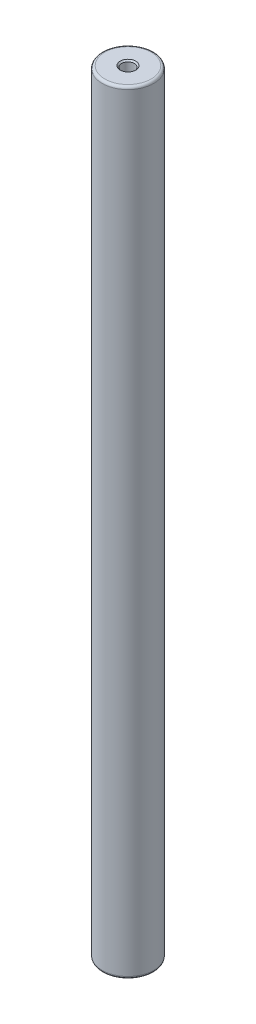
ISO-10303-21;
HEADER;
FILE_DESCRIPTION(('STEP AP214'),'2;1');
FILE_NAME('part.step','',(''),(''),'','','');
FILE_SCHEMA(('AUTOMOTIVE_DESIGN { 1 0 10303 214 1 1 1 1 }'));
ENDSEC;
DATA;
#1=APPLICATION_CONTEXT('core data for automotive mechanical design processes');
#2=APPLICATION_PROTOCOL_DEFINITION('international standard','automotive_design',2000,#1);
#3=PRODUCT_CONTEXT('',#1,'mechanical');
#4=PRODUCT('Part','Part','',(#3));
#5=PRODUCT_RELATED_PRODUCT_CATEGORY('part','',(#4));
#6=PRODUCT_DEFINITION_FORMATION('','',#4);
#7=PRODUCT_DEFINITION_CONTEXT('part definition',#1,'design');
#8=PRODUCT_DEFINITION('design','',#6,#7);
#9=PRODUCT_DEFINITION_SHAPE('','',#8);
#10=(LENGTH_UNIT() NAMED_UNIT(*) SI_UNIT(.MILLI.,.METRE.));
#11=(NAMED_UNIT(*) PLANE_ANGLE_UNIT() SI_UNIT($,.RADIAN.));
#12=(NAMED_UNIT(*) SI_UNIT($,.STERADIAN.) SOLID_ANGLE_UNIT());
#13=UNCERTAINTY_MEASURE_WITH_UNIT(LENGTH_MEASURE(1.E-05),#10,'distance_accuracy_value','');
#14=(GEOMETRIC_REPRESENTATION_CONTEXT(3) GLOBAL_UNCERTAINTY_ASSIGNED_CONTEXT((#13)) GLOBAL_UNIT_ASSIGNED_CONTEXT((#10,
#11,#12)) REPRESENTATION_CONTEXT('',''));
#15=CARTESIAN_POINT('',(0.,0.,0.));
#16=DIRECTION('',(0.,0.,1.));
#17=DIRECTION('',(1.,0.,0.));
#18=AXIS2_PLACEMENT_3D('',#15,#16,#17);
#19=CARTESIAN_POINT('',(0.,300.,0.));
#20=DIRECTION('',(0.,-1.,0.));
#21=DIRECTION('',(0.,0.,-1.));
#22=AXIS2_PLACEMENT_3D('',#19,#20,#21);
#23=CYLINDRICAL_SURFACE('',#22,10.);
#24=CARTESIAN_POINT('',(0.,1.,0.));
#25=DIRECTION('',(0.,1.,0.));
#26=DIRECTION('',(0.,0.,1.));
#27=AXIS2_PLACEMENT_3D('',#24,#25,#26);
#28=CIRCLE('',#27,10.);
#29=CARTESIAN_POINT('',(0.,1.,10.));
#30=VERTEX_POINT('',#29);
#31=EDGE_CURVE('E45',#30,#30,#28,.T.);
#32=ORIENTED_EDGE('',*,*,#31,.T.);
#33=EDGE_LOOP('',(#32));
#34=FACE_BOUND('',#33,.T.);
#35=CARTESIAN_POINT('',(0.,299.,0.));
#36=DIRECTION('',(0.,1.,0.));
#37=DIRECTION('',(0.,0.,1.));
#38=AXIS2_PLACEMENT_3D('',#35,#36,#37);
#39=CIRCLE('',#38,10.);
#40=CARTESIAN_POINT('',(0.,299.,10.));
#41=VERTEX_POINT('',#40);
#42=EDGE_CURVE('E62',#41,#41,#39,.F.);
#43=ORIENTED_EDGE('',*,*,#42,.T.);
#44=EDGE_LOOP('',(#43));
#45=FACE_BOUND('',#44,.T.);
#46=ADVANCED_FACE('F38',(#34,#45),#23,.T.);
#47=CARTESIAN_POINT('',(0.,300.,0.));
#48=DIRECTION('',(0.,1.,0.));
#49=DIRECTION('',(0.,0.,1.));
#50=AXIS2_PLACEMENT_3D('',#47,#48,#49);
#51=PLANE('',#50);
#52=CARTESIAN_POINT('',(0.,300.,0.));
#53=DIRECTION('',(0.,1.,0.));
#54=DIRECTION('',(0.,0.,1.));
#55=AXIS2_PLACEMENT_3D('',#52,#53,#54);
#56=CIRCLE('',#55,9.);
#57=CARTESIAN_POINT('',(0.,300.,9.));
#58=VERTEX_POINT('',#57);
#59=EDGE_CURVE('E58',#58,#58,#56,.T.);
#60=ORIENTED_EDGE('',*,*,#59,.T.);
#61=EDGE_LOOP('',(#60));
#62=FACE_BOUND('',#61,.T.);
#63=CARTESIAN_POINT('',(0.,300.,0.));
#64=DIRECTION('',(0.,1.,0.));
#65=DIRECTION('',(0.,0.,1.));
#66=AXIS2_PLACEMENT_3D('',#63,#64,#65);
#67=CIRCLE('',#66,3.025);
#68=CARTESIAN_POINT('',(0.,300.,3.025));
#69=VERTEX_POINT('',#68);
#70=EDGE_CURVE('E65',#69,#69,#67,.T.);
#71=ORIENTED_EDGE('',*,*,#70,.F.);
#72=EDGE_LOOP('',(#71));
#73=FACE_BOUND('',#72,.T.);
#74=ADVANCED_FACE('F85',(#62,#73),#51,.T.);
#75=CARTESIAN_POINT('',(0.,0.,0.));
#76=DIRECTION('',(0.,1.,0.));
#77=DIRECTION('',(0.,0.,1.));
#78=AXIS2_PLACEMENT_3D('',#75,#76,#77);
#79=PLANE('',#78);
#80=CARTESIAN_POINT('',(0.,0.,0.));
#81=DIRECTION('',(0.,1.,0.));
#82=DIRECTION('',(0.,0.,1.));
#83=AXIS2_PLACEMENT_3D('',#80,#81,#82);
#84=CIRCLE('',#83,9.);
#85=CARTESIAN_POINT('',(0.,0.,9.));
#86=VERTEX_POINT('',#85);
#87=EDGE_CURVE('E11',#86,#86,#84,.F.);
#88=ORIENTED_EDGE('',*,*,#87,.T.);
#89=EDGE_LOOP('',(#88));
#90=FACE_BOUND('',#89,.T.);
#91=ADVANCED_FACE('F52',(#90),#79,.F.);
#92=CARTESIAN_POINT('',(0.,285.,0.));
#93=DIRECTION('',(0.,1.,0.));
#94=DIRECTION('',(0.,0.,1.));
#95=AXIS2_PLACEMENT_3D('',#92,#93,#94);
#96=CONICAL_SURFACE('',#95,2.5,1.02974425867666);
#97=CARTESIAN_POINT('',(0.,283.497848452431,0.));
#98=VERTEX_POINT('',#97);
#99=VERTEX_LOOP('',#98);
#100=FACE_BOUND('',#99,.T.);
#101=CARTESIAN_POINT('',(0.,285.,0.));
#102=DIRECTION('',(0.,1.,0.));
#103=DIRECTION('',(0.,0.,1.));
#104=AXIS2_PLACEMENT_3D('',#101,#102,#103);
#105=CIRCLE('',#104,2.5);
#106=CARTESIAN_POINT('',(0.,285.,2.5));
#107=VERTEX_POINT('',#106);
#108=EDGE_CURVE('E56',#107,#107,#105,.T.);
#109=ORIENTED_EDGE('',*,*,#108,.T.);
#110=EDGE_LOOP('',(#109));
#111=FACE_BOUND('',#110,.T.);
#112=ADVANCED_FACE('F48',(#100,#111),#96,.F.);
#113=CARTESIAN_POINT('',(0.,300.,0.));
#114=DIRECTION('',(0.,1.,0.));
#115=DIRECTION('',(0.,0.,1.));
#116=AXIS2_PLACEMENT_3D('',#113,#114,#115);
#117=CYLINDRICAL_SURFACE('',#116,2.5);
#118=ORIENTED_EDGE('',*,*,#108,.F.);
#119=EDGE_LOOP('',(#118));
#120=FACE_BOUND('',#119,.T.);
#121=CARTESIAN_POINT('',(0.,299.475,0.));
#122=DIRECTION('',(0.,1.,0.));
#123=DIRECTION('',(0.,0.,1.));
#124=AXIS2_PLACEMENT_3D('',#121,#122,#123);
#125=CIRCLE('',#124,2.5);
#126=CARTESIAN_POINT('',(0.,299.475,2.5));
#127=VERTEX_POINT('',#126);
#128=EDGE_CURVE('E59',#127,#127,#125,.T.);
#129=ORIENTED_EDGE('',*,*,#128,.T.);
#130=EDGE_LOOP('',(#129));
#131=FACE_BOUND('',#130,.T.);
#132=ADVANCED_FACE('F51',(#120,#131),#117,.F.);
#133=CARTESIAN_POINT('',(0.,300.,0.));
#134=DIRECTION('',(0.,1.,0.));
#135=DIRECTION('',(0.,0.,1.));
#136=AXIS2_PLACEMENT_3D('',#133,#134,#135);
#137=CONICAL_SURFACE('',#136,3.025,0.785398163397451);
#138=ORIENTED_EDGE('',*,*,#128,.F.);
#139=EDGE_LOOP('',(#138));
#140=FACE_BOUND('',#139,.T.);
#141=ORIENTED_EDGE('',*,*,#70,.T.);
#142=EDGE_LOOP('',(#141));
#143=FACE_BOUND('',#142,.T.);
#144=ADVANCED_FACE('F81',(#140,#143),#137,.F.);
#145=CARTESIAN_POINT('',(0.,299.,0.));
#146=DIRECTION('',(0.,1.,0.));
#147=DIRECTION('',(0.,0.,1.));
#148=AXIS2_PLACEMENT_3D('',#145,#146,#147);
#149=TOROIDAL_SURFACE('',#148,9.,1.);
#150=ORIENTED_EDGE('',*,*,#42,.F.);
#151=EDGE_LOOP('',(#150));
#152=FACE_BOUND('',#151,.T.);
#153=ORIENTED_EDGE('',*,*,#59,.F.);
#154=EDGE_LOOP('',(#153));
#155=FACE_BOUND('',#154,.T.);
#156=ADVANCED_FACE('F76',(#152,#155),#149,.T.);
#157=CARTESIAN_POINT('',(0.,1.,0.));
#158=DIRECTION('',(0.,1.,0.));
#159=DIRECTION('',(0.,0.,1.));
#160=AXIS2_PLACEMENT_3D('',#157,#158,#159);
#161=TOROIDAL_SURFACE('',#160,9.,1.);
#162=ORIENTED_EDGE('',*,*,#87,.F.);
#163=EDGE_LOOP('',(#162));
#164=FACE_BOUND('',#163,.T.);
#165=ORIENTED_EDGE('',*,*,#31,.F.);
#166=EDGE_LOOP('',(#165));
#167=FACE_BOUND('',#166,.T.);
#168=ADVANCED_FACE('F40',(#164,#167),#161,.T.);
#169=CLOSED_SHELL('',(#46,#74,#91,#112,#132,#144,#156,#168));
#170=MANIFOLD_SOLID_BREP('B2',#169);
#171=ADVANCED_BREP_SHAPE_REPRESENTATION('',(#18,#170),#14);
#172=SHAPE_DEFINITION_REPRESENTATION(#9,#171);
ENDSEC;
END-ISO-10303-21;
